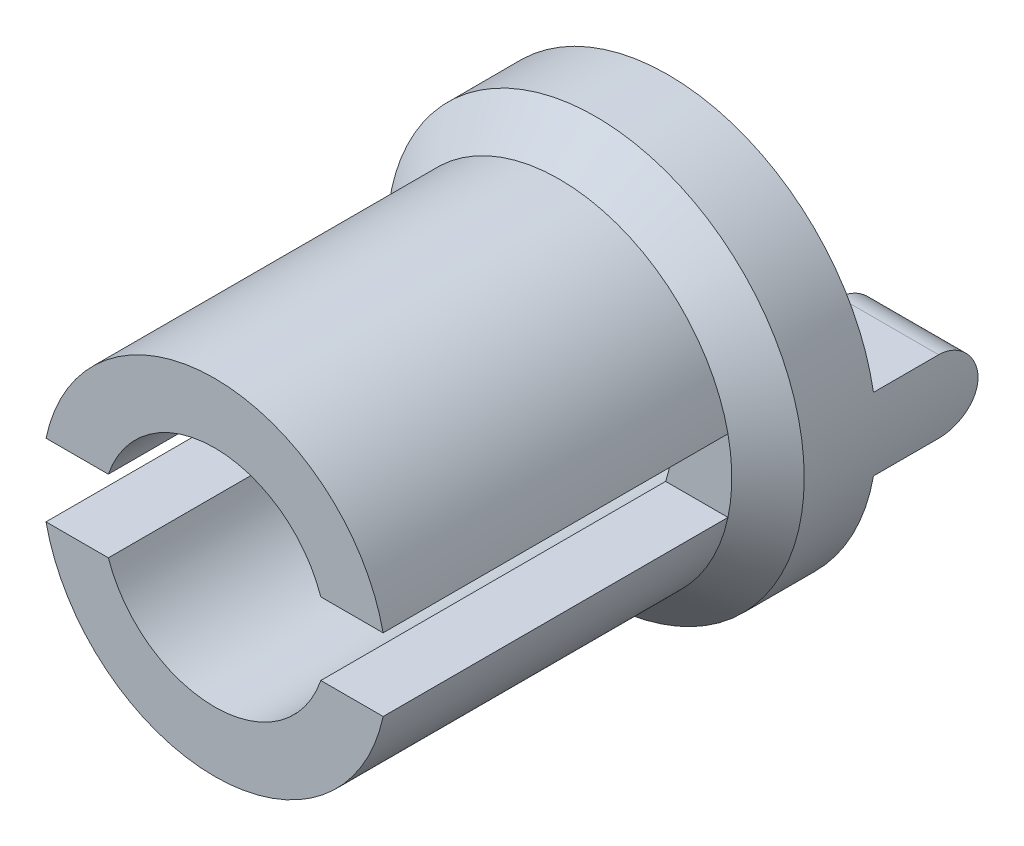
ISO-10303-21;
HEADER;
FILE_DESCRIPTION(('STEP AP214'),'2;1');
FILE_NAME('part.step','',(''),(''),'','','');
FILE_SCHEMA(('AUTOMOTIVE_DESIGN { 1 0 10303 214 1 1 1 1 }'));
ENDSEC;
DATA;
#1=APPLICATION_CONTEXT('core data for automotive mechanical design processes');
#2=APPLICATION_PROTOCOL_DEFINITION('international standard','automotive_design',2000,#1);
#3=PRODUCT_CONTEXT('',#1,'mechanical');
#4=PRODUCT('Part','Part','',(#3));
#5=PRODUCT_RELATED_PRODUCT_CATEGORY('part','',(#4));
#6=PRODUCT_DEFINITION_FORMATION('','',#4);
#7=PRODUCT_DEFINITION_CONTEXT('part definition',#1,'design');
#8=PRODUCT_DEFINITION('design','',#6,#7);
#9=PRODUCT_DEFINITION_SHAPE('','',#8);
#10=(LENGTH_UNIT() NAMED_UNIT(*) SI_UNIT(.MILLI.,.METRE.));
#11=(NAMED_UNIT(*) PLANE_ANGLE_UNIT() SI_UNIT($,.RADIAN.));
#12=(NAMED_UNIT(*) SI_UNIT($,.STERADIAN.) SOLID_ANGLE_UNIT());
#13=UNCERTAINTY_MEASURE_WITH_UNIT(LENGTH_MEASURE(1.E-05),#10,'distance_accuracy_value','');
#14=(GEOMETRIC_REPRESENTATION_CONTEXT(3) GLOBAL_UNCERTAINTY_ASSIGNED_CONTEXT((#13)) GLOBAL_UNIT_ASSIGNED_CONTEXT((#10,
#11,#12)) REPRESENTATION_CONTEXT('',''));
#15=CARTESIAN_POINT('',(0.,0.,0.));
#16=DIRECTION('',(0.,0.,1.));
#17=DIRECTION('',(1.,0.,0.));
#18=AXIS2_PLACEMENT_3D('',#15,#16,#17);
#19=CARTESIAN_POINT('',(0.,0.,3.));
#20=DIRECTION('',(0.,0.,1.));
#21=DIRECTION('',(1.,0.,0.));
#22=AXIS2_PLACEMENT_3D('',#19,#20,#21);
#23=PLANE('',#22);
#24=DIRECTION('',(1.,0.,0.));
#25=VECTOR('',#24,1.);
#26=CARTESIAN_POINT('',(0.,1.,3.));
#27=LINE('',#26,#25);
#28=CARTESIAN_POINT('',(-4.65632969730452,1.,3.));
#29=VERTEX_POINT('',#28);
#30=CARTESIAN_POINT('',(-2.93428015022424,1.,3.));
#31=VERTEX_POINT('',#30);
#32=EDGE_CURVE('E267',#29,#31,#27,.T.);
#33=ORIENTED_EDGE('',*,*,#32,.F.);
#34=CARTESIAN_POINT('',(0.,0.,3.));
#35=DIRECTION('',(0.,0.,1.));
#36=DIRECTION('',(1.,0.,0.));
#37=AXIS2_PLACEMENT_3D('',#34,#35,#36);
#38=CIRCLE('',#37,4.7625);
#39=CARTESIAN_POINT('',(-4.65632969730452,-1.,3.));
#40=VERTEX_POINT('',#39);
#41=EDGE_CURVE('E51',#29,#40,#38,.T.);
#42=ORIENTED_EDGE('',*,*,#41,.T.);
#43=DIRECTION('',(1.,0.,0.));
#44=VECTOR('',#43,1.);
#45=CARTESIAN_POINT('',(0.,-1.,3.));
#46=LINE('',#45,#44);
#47=CARTESIAN_POINT('',(-2.93428015022424,-1.,3.));
#48=VERTEX_POINT('',#47);
#49=EDGE_CURVE('E300',#40,#48,#46,.T.);
#50=ORIENTED_EDGE('',*,*,#49,.T.);
#51=CARTESIAN_POINT('',(0.,0.,3.));
#52=DIRECTION('',(0.,0.,1.));
#53=DIRECTION('',(1.,0.,0.));
#54=AXIS2_PLACEMENT_3D('',#51,#52,#53);
#55=CIRCLE('',#54,3.1);
#56=EDGE_CURVE('E317',#31,#48,#55,.T.);
#57=ORIENTED_EDGE('',*,*,#56,.F.);
#58=EDGE_LOOP('',(#33,#42,#50,#57));
#59=FACE_BOUND('',#58,.T.);
#60=ADVANCED_FACE('F42',(#59),#23,.T.);
#61=CARTESIAN_POINT('',(0.,0.,0.));
#62=DIRECTION('',(0.,0.,1.));
#63=DIRECTION('',(1.,0.,0.));
#64=AXIS2_PLACEMENT_3D('',#61,#62,#63);
#65=PLANE('',#64);
#66=DIRECTION('',(-1.,0.,0.));
#67=VECTOR('',#66,1.);
#68=CARTESIAN_POINT('',(0.,-1.,0.));
#69=LINE('',#68,#67);
#70=CARTESIAN_POINT('',(-2.93428015022424,-1.,0.));
#71=VERTEX_POINT('',#70);
#72=CARTESIAN_POINT('',(-5.67506883218169,-1.,0.));
#73=VERTEX_POINT('',#72);
#74=EDGE_CURVE('E171',#71,#73,#69,.T.);
#75=ORIENTED_EDGE('',*,*,#74,.F.);
#76=CARTESIAN_POINT('',(0.,0.,0.));
#77=DIRECTION('',(0.,0.,1.));
#78=DIRECTION('',(1.,0.,0.));
#79=AXIS2_PLACEMENT_3D('',#76,#77,#78);
#80=CIRCLE('',#79,3.1);
#81=CARTESIAN_POINT('',(2.93428015022424,-0.999999999999999,0.));
#82=VERTEX_POINT('',#81);
#83=EDGE_CURVE('E179',#71,#82,#80,.T.);
#84=ORIENTED_EDGE('',*,*,#83,.T.);
#85=DIRECTION('',(-1.,0.,0.));
#86=VECTOR('',#85,1.);
#87=CARTESIAN_POINT('',(0.,-0.999999999999999,0.));
#88=LINE('',#87,#86);
#89=CARTESIAN_POINT('',(5.67506883218169,-0.999999999999999,0.));
#90=VERTEX_POINT('',#89);
#91=EDGE_CURVE('E207',#90,#82,#88,.T.);
#92=ORIENTED_EDGE('',*,*,#91,.F.);
#93=CARTESIAN_POINT('',(0.,0.,0.));
#94=DIRECTION('',(0.,0.,1.));
#95=DIRECTION('',(1.,0.,0.));
#96=AXIS2_PLACEMENT_3D('',#93,#94,#95);
#97=CIRCLE('',#96,5.7625);
#98=EDGE_CURVE('E194',#73,#90,#97,.T.);
#99=ORIENTED_EDGE('',*,*,#98,.F.);
#100=EDGE_LOOP('',(#75,#84,#92,#99));
#101=FACE_BOUND('',#100,.T.);
#102=ADVANCED_FACE('F192',(#101),#65,.F.);
#103=CARTESIAN_POINT('',(2.93428015022424,1.,0.));
#104=VERTEX_POINT('',#103);
#105=CARTESIAN_POINT('',(-2.93428015022424,1.,0.));
#106=VERTEX_POINT('',#105);
#107=EDGE_CURVE('E188',#104,#106,#80,.T.);
#108=ORIENTED_EDGE('',*,*,#107,.T.);
#109=DIRECTION('',(-1.,0.,0.));
#110=VECTOR('',#109,1.);
#111=CARTESIAN_POINT('',(0.,1.,0.));
#112=LINE('',#111,#110);
#113=CARTESIAN_POINT('',(-5.67506883218169,1.,0.));
#114=VERTEX_POINT('',#113);
#115=EDGE_CURVE('E197',#106,#114,#112,.T.);
#116=ORIENTED_EDGE('',*,*,#115,.T.);
#117=CARTESIAN_POINT('',(5.67506883218169,1.,0.));
#118=VERTEX_POINT('',#117);
#119=EDGE_CURVE('E189',#118,#114,#97,.T.);
#120=ORIENTED_EDGE('',*,*,#119,.F.);
#121=DIRECTION('',(-1.,0.,0.));
#122=VECTOR('',#121,1.);
#123=CARTESIAN_POINT('',(0.,1.,0.));
#124=LINE('',#123,#122);
#125=EDGE_CURVE('E213',#118,#104,#124,.T.);
#126=ORIENTED_EDGE('',*,*,#125,.T.);
#127=EDGE_LOOP('',(#108,#116,#120,#126));
#128=FACE_BOUND('',#127,.T.);
#129=ADVANCED_FACE('F488',(#128),#65,.F.);
#130=DIRECTION('',(1.,0.,0.));
#131=VECTOR('',#130,1.);
#132=CARTESIAN_POINT('',(0.,-0.999999999999999,3.));
#133=LINE('',#132,#131);
#134=CARTESIAN_POINT('',(2.93428015022424,-0.999999999999999,3.));
#135=VERTEX_POINT('',#134);
#136=CARTESIAN_POINT('',(4.65632969730452,-0.999999999999999,3.));
#137=VERTEX_POINT('',#136);
#138=EDGE_CURVE('E308',#135,#137,#133,.T.);
#139=ORIENTED_EDGE('',*,*,#138,.T.);
#140=CARTESIAN_POINT('',(0.,0.,3.));
#141=DIRECTION('',(0.,0.,1.));
#142=DIRECTION('',(1.,0.,0.));
#143=AXIS2_PLACEMENT_3D('',#140,#141,#142);
#144=CIRCLE('',#143,4.7625);
#145=CARTESIAN_POINT('',(4.65632969730452,1.,3.));
#146=VERTEX_POINT('',#145);
#147=EDGE_CURVE('E404',#137,#146,#144,.T.);
#148=ORIENTED_EDGE('',*,*,#147,.T.);
#149=DIRECTION('',(1.,0.,0.));
#150=VECTOR('',#149,1.);
#151=CARTESIAN_POINT('',(0.,1.,3.));
#152=LINE('',#151,#150);
#153=CARTESIAN_POINT('',(2.93428015022424,1.,3.));
#154=VERTEX_POINT('',#153);
#155=EDGE_CURVE('E259',#154,#146,#152,.T.);
#156=ORIENTED_EDGE('',*,*,#155,.F.);
#157=EDGE_CURVE('E312',#135,#154,#55,.T.);
#158=ORIENTED_EDGE('',*,*,#157,.F.);
#159=EDGE_LOOP('',(#139,#148,#156,#158));
#160=FACE_BOUND('',#159,.T.);
#161=ADVANCED_FACE('F344',(#160),#23,.T.);
#162=CARTESIAN_POINT('',(0.,0.,3.));
#163=DIRECTION('',(0.,0.,-1.));
#164=DIRECTION('',(-1.,0.,0.));
#165=AXIS2_PLACEMENT_3D('',#162,#163,#164);
#166=CYLINDRICAL_SURFACE('',#165,5.7625);
#167=CARTESIAN_POINT('',(0.,0.,1.99999999999999));
#168=DIRECTION('',(0.,0.,1.));
#169=DIRECTION('',(1.,0.,0.));
#170=AXIS2_PLACEMENT_3D('',#167,#168,#169);
#171=CIRCLE('',#170,5.7625);
#172=CARTESIAN_POINT('',(5.7625,0.,1.99999999999999));
#173=VERTEX_POINT('',#172);
#174=EDGE_CURVE('E12',#173,#173,#171,.F.);
#175=ORIENTED_EDGE('',*,*,#174,.T.);
#176=EDGE_LOOP('',(#175));
#177=FACE_BOUND('',#176,.T.);
#178=CARTESIAN_POINT('',(-5.67506883218169,1.,-1.8));
#179=CARTESIAN_POINT('',(-5.67506761308075,1.000000065407,-1.82790897120952));
#180=CARTESIAN_POINT('',(-5.67527497134184,0.998830894949917,-1.85580436135374));
#181=CARTESIAN_POINT('',(-5.67609408232163,0.994168254377589,-1.91139130437918));
#182=CARTESIAN_POINT('',(-5.67670579270925,0.990675027564385,-1.93908287829083));
#183=CARTESIAN_POINT('',(-5.67912472225758,0.976751217564912,-2.02147102829651));
#184=CARTESIAN_POINT('',(-5.68151585375878,0.962876354040546,-2.0756091010125));
#185=CARTESIAN_POINT('',(-5.68758361984008,0.926356865417077,-2.180742820369));
#186=CARTESIAN_POINT('',(-5.69126053148962,0.903710350024101,-2.23173778692155));
#187=CARTESIAN_POINT('',(-5.69948387045683,0.85030417934323,-2.32921644227469));
#188=CARTESIAN_POINT('',(-5.70403034610672,0.819544073048633,-2.37569988009832));
#189=CARTESIAN_POINT('',(-5.71353378389499,0.750441398098643,-2.46331017142147));
#190=CARTESIAN_POINT('',(-5.71849420803219,0.71203016120623,-2.50438246694667));
#191=CARTESIAN_POINT('',(-5.72823672839943,0.628856064014108,-2.57953940798728));
#192=CARTESIAN_POINT('',(-5.73301879066794,0.584092001803853,-2.61362272824685));
#193=CARTESIAN_POINT('',(-5.74190332971123,0.489121584723125,-2.67404215307671));
#194=CARTESIAN_POINT('',(-5.74600101749023,0.438880638576444,-2.70032458847822));
#195=CARTESIAN_POINT('',(-5.75301259414362,0.334625004593369,-2.74404224757705));
#196=CARTESIAN_POINT('',(-5.75592727783155,0.280612879152169,-2.76148341334066));
#197=CARTESIAN_POINT('',(-5.75953260783793,0.188573623650048,-2.78279237808017));
#198=CARTESIAN_POINT('',(-5.76063956225957,0.151139402472241,-2.78923856903874));
#199=CARTESIAN_POINT('',(-5.76212569904172,0.0758092727272534,-2.79784328500391));
#200=CARTESIAN_POINT('',(-5.76250568111496,0.0379139176888234,-2.80000652160606));
#201=CARTESIAN_POINT('',(-5.7625,0.,-2.8));
#202=B_SPLINE_CURVE_WITH_KNOTS('',3,(#178,#179,#180,#181,#182,#183,#184,#185,#186,#187,#188,
#189,#190,#191,#192,#193,#194,#195,#196,#197,#198,#199,#200,#201),.UNSPECIFIED.,.F.,.F.,(4,2,2,
2,2,2,2,2,2,2,2,4),(0.,0.0836748099233242,0.167340861431851,0.334293708539799,0.501282554076887,
0.668280683908238,0.83685124416334,1.00545373942264,1.17519065568897,1.34481334292312,
1.45858123177262,1.57222389706663),.UNSPECIFIED.);
#203=CARTESIAN_POINT('',(-5.67506883218169,1.,-1.8));
#204=VERTEX_POINT('',#203);
#205=CARTESIAN_POINT('',(-5.7625,0.,-2.8));
#206=VERTEX_POINT('',#205);
#207=EDGE_CURVE('E355',#204,#206,#202,.T.);
#208=ORIENTED_EDGE('',*,*,#207,.T.);
#209=CARTESIAN_POINT('',(-5.7625,0.,-2.8));
#210=CARTESIAN_POINT('',(-5.7625011256584,-0.0279121800445883,-2.80000005673222));
#211=CARTESIAN_POINT('',(-5.76229694663717,-0.0558107894566316,-2.79883062550432));
#212=CARTESIAN_POINT('',(-5.76148993515163,-0.1114043518985,-2.79416688988909));
#213=CARTESIAN_POINT('',(-5.76088714323856,-0.139099325354644,-2.79067282198889));
#214=CARTESIAN_POINT('',(-5.75850229549269,-0.221498876087656,-2.7767453684338));
#215=CARTESIAN_POINT('',(-5.75614366145759,-0.275645184061358,-2.76286658402921));
#216=CARTESIAN_POINT('',(-5.75014636628449,-0.380795827446639,-2.72633568167711));
#217=CARTESIAN_POINT('',(-5.74650741228151,-0.431799440847596,-2.70368155630692));
#218=CARTESIAN_POINT('',(-5.73834903396463,-0.529292347652433,-2.65025760284812));
#219=CARTESIAN_POINT('',(-5.73382956825864,-0.575781428678063,-2.61948739320536));
#220=CARTESIAN_POINT('',(-5.72435926138972,-0.663385216920923,-2.55037447781006));
#221=CARTESIAN_POINT('',(-5.71940486721888,-0.704447136423945,-2.51196537530801));
#222=CARTESIAN_POINT('',(-5.70964917500229,-0.779584097439509,-2.4287998154759));
#223=CARTESIAN_POINT('',(-5.70484790726327,-0.813657762997791,-2.38404211106507));
#224=CARTESIAN_POINT('',(-5.69590690853097,-0.874066954956763,-2.28907737910652));
#225=CARTESIAN_POINT('',(-5.69177200552945,-0.900347073509347,-2.23883465129004));
#226=CARTESIAN_POINT('',(-5.68468561972967,-0.944059849120996,-2.13457540150781));
#227=CARTESIAN_POINT('',(-5.68173333281112,-0.961498520076803,-2.08056147321647));
#228=CARTESIAN_POINT('',(-5.67807934073008,-0.982800535313677,-1.98852908320348));
#229=CARTESIAN_POINT('',(-5.67695660430286,-0.989243595437331,-1.95110410646962));
#230=CARTESIAN_POINT('',(-5.67544872883625,-0.997844269319137,-1.87579193486806));
#231=CARTESIAN_POINT('',(-5.67506278872994,-1.00000653737687,-1.83790528711395));
#232=CARTESIAN_POINT('',(-5.67506883218169,-1.,-1.8));
#233=B_SPLINE_CURVE_WITH_KNOTS('',3,(#209,#210,#211,#212,#213,#214,#215,#216,#217,#218,#219,
#220,#221,#222,#223,#224,#225,#226,#227,#228,#229,#230,#231,#232),.UNSPECIFIED.,.F.,.F.,(4,2,2,
2,2,2,2,2,2,2,2,4),(0.,0.0836844653686418,0.167360418751614,0.334335933607548,0.501349667898434,
0.668371255255003,0.836913575458956,1.00548904905975,1.17523575140677,1.34486683769533,
1.45860720288724,1.57222383558073),.UNSPECIFIED.);
#234=CARTESIAN_POINT('',(-5.67506883218169,-1.,-1.8));
#235=VERTEX_POINT('',#234);
#236=EDGE_CURVE('E361',#206,#235,#233,.T.);
#237=ORIENTED_EDGE('',*,*,#236,.T.);
#238=DIRECTION('',(0.,0.,1.));
#239=VECTOR('',#238,1.);
#240=CARTESIAN_POINT('',(-5.67506883218169,-1.,-2.8));
#241=LINE('',#240,#239);
#242=EDGE_CURVE('E176',#235,#73,#241,.T.);
#243=ORIENTED_EDGE('',*,*,#242,.T.);
#244=ORIENTED_EDGE('',*,*,#98,.T.);
#245=DIRECTION('',(0.,0.,1.));
#246=VECTOR('',#245,1.);
#247=CARTESIAN_POINT('',(5.67506883218169,-0.999999999999999,-2.8));
#248=LINE('',#247,#246);
#249=CARTESIAN_POINT('',(5.67506883218169,-0.999999999999999,-1.8));
#250=VERTEX_POINT('',#249);
#251=EDGE_CURVE('E224',#250,#90,#248,.T.);
#252=ORIENTED_EDGE('',*,*,#251,.F.);
#253=CARTESIAN_POINT('',(5.67506883218169,-0.999999999999999,-1.8));
#254=CARTESIAN_POINT('',(5.67506761308075,-1.000000065407,-1.82790897120952));
#255=CARTESIAN_POINT('',(5.67527497134184,-0.998830894949916,-1.85580436135374));
#256=CARTESIAN_POINT('',(5.67609408232163,-0.994168254377588,-1.91139130437918));
#257=CARTESIAN_POINT('',(5.67670579270925,-0.990675027564385,-1.93908287829083));
#258=CARTESIAN_POINT('',(5.67912472225758,-0.976751217564912,-2.02147102829651));
#259=CARTESIAN_POINT('',(5.68151585375878,-0.962876354040545,-2.0756091010125));
#260=CARTESIAN_POINT('',(5.68758361984008,-0.926356865417076,-2.180742820369));
#261=CARTESIAN_POINT('',(5.69126053148962,-0.903710350024101,-2.23173778692155));
#262=CARTESIAN_POINT('',(5.69948387045683,-0.850304179343229,-2.32921644227469));
#263=CARTESIAN_POINT('',(5.70403034610672,-0.819544073048633,-2.37569988009832));
#264=CARTESIAN_POINT('',(5.71353378389499,-0.750441398098643,-2.46331017142147));
#265=CARTESIAN_POINT('',(5.71849420803219,-0.71203016120623,-2.50438246694667));
#266=CARTESIAN_POINT('',(5.72823672839943,-0.628856064014108,-2.57953940798728));
#267=CARTESIAN_POINT('',(5.73301879066794,-0.584092001803853,-2.61362272824685));
#268=CARTESIAN_POINT('',(5.74190332971123,-0.489121584723125,-2.67404215307671));
#269=CARTESIAN_POINT('',(5.74600101749023,-0.438880638576444,-2.70032458847822));
#270=CARTESIAN_POINT('',(5.75301259414362,-0.334625004593369,-2.74404224757705));
#271=CARTESIAN_POINT('',(5.75592727783155,-0.280612879152169,-2.76148341334066));
#272=CARTESIAN_POINT('',(5.75953260783793,-0.188573623650048,-2.78279237808017));
#273=CARTESIAN_POINT('',(5.76063956225957,-0.151139402472241,-2.78923856903874));
#274=CARTESIAN_POINT('',(5.76212569904172,-0.0758092727272531,-2.79784328500391));
#275=CARTESIAN_POINT('',(5.76250568111496,-0.037913917688823,-2.80000652160606));
#276=CARTESIAN_POINT('',(5.7625,0.,-2.8));
#277=B_SPLINE_CURVE_WITH_KNOTS('',3,(#253,#254,#255,#256,#257,#258,#259,#260,#261,#262,#263,
#264,#265,#266,#267,#268,#269,#270,#271,#272,#273,#274,#275,#276),.UNSPECIFIED.,.F.,.F.,(4,2,2,
2,2,2,2,2,2,2,2,4),(0.,0.0836748099233242,0.167340861431851,0.334293708539799,0.501282554076887,
0.668280683908238,0.83685124416334,1.00545373942264,1.17519065568897,1.34481334292312,
1.45858123177262,1.57222389706663),.UNSPECIFIED.);
#278=CARTESIAN_POINT('',(5.7625,0.,-2.8));
#279=VERTEX_POINT('',#278);
#280=EDGE_CURVE('E316',#250,#279,#277,.T.);
#281=ORIENTED_EDGE('',*,*,#280,.T.);
#282=CARTESIAN_POINT('',(5.7625,0.,-2.8));
#283=CARTESIAN_POINT('',(5.7625011256584,0.0279121800445883,-2.80000005673222));
#284=CARTESIAN_POINT('',(5.76229694663717,0.0558107894566315,-2.79883062550432));
#285=CARTESIAN_POINT('',(5.76148993515163,0.1114043518985,-2.79416688988909));
#286=CARTESIAN_POINT('',(5.76088714323856,0.139099325354644,-2.79067282198889));
#287=CARTESIAN_POINT('',(5.75850229549269,0.221498876087656,-2.7767453684338));
#288=CARTESIAN_POINT('',(5.75614366145759,0.275645184061358,-2.76286658402921));
#289=CARTESIAN_POINT('',(5.75014636628449,0.380795827446639,-2.72633568167711));
#290=CARTESIAN_POINT('',(5.74650741228151,0.431799440847596,-2.70368155630692));
#291=CARTESIAN_POINT('',(5.73834903396463,0.529292347652433,-2.65025760284812));
#292=CARTESIAN_POINT('',(5.73382956825864,0.575781428678063,-2.61948739320536));
#293=CARTESIAN_POINT('',(5.72435926138972,0.663385216920923,-2.55037447781006));
#294=CARTESIAN_POINT('',(5.71940486721888,0.704447136423945,-2.51196537530801));
#295=CARTESIAN_POINT('',(5.70964917500229,0.779584097439509,-2.4287998154759));
#296=CARTESIAN_POINT('',(5.70484790726327,0.813657762997791,-2.38404211106507));
#297=CARTESIAN_POINT('',(5.69590690853097,0.874066954956763,-2.28907737910652));
#298=CARTESIAN_POINT('',(5.69177200552945,0.900347073509347,-2.23883465129004));
#299=CARTESIAN_POINT('',(5.68468561972967,0.944059849120996,-2.13457540150781));
#300=CARTESIAN_POINT('',(5.68173333281112,0.961498520076803,-2.08056147321647));
#301=CARTESIAN_POINT('',(5.67807934073008,0.982800535313677,-1.98852908320348));
#302=CARTESIAN_POINT('',(5.67695660430286,0.989243595437331,-1.95110410646962));
#303=CARTESIAN_POINT('',(5.67544872883625,0.997844269319137,-1.87579193486806));
#304=CARTESIAN_POINT('',(5.67506278872994,1.00000653737687,-1.83790528711395));
#305=CARTESIAN_POINT('',(5.67506883218169,1.,-1.8));
#306=B_SPLINE_CURVE_WITH_KNOTS('',3,(#282,#283,#284,#285,#286,#287,#288,#289,#290,#291,#292,
#293,#294,#295,#296,#297,#298,#299,#300,#301,#302,#303,#304,#305),.UNSPECIFIED.,.F.,.F.,(4,2,2,
2,2,2,2,2,2,2,2,4),(0.,0.0836844653686418,0.167360418751614,0.334335933607548,0.501349667898434,
0.668371255255003,0.836913575458956,1.00548904905975,1.17523575140677,1.34486683769533,
1.45860720288724,1.57222383558073),.UNSPECIFIED.);
#307=CARTESIAN_POINT('',(5.67506883218169,1.,-1.8));
#308=VERTEX_POINT('',#307);
#309=EDGE_CURVE('E330',#279,#308,#306,.T.);
#310=ORIENTED_EDGE('',*,*,#309,.T.);
#311=DIRECTION('',(0.,0.,1.));
#312=VECTOR('',#311,1.);
#313=CARTESIAN_POINT('',(5.67506883218169,1.,-2.8));
#314=LINE('',#313,#312);
#315=EDGE_CURVE('E221',#308,#118,#314,.T.);
#316=ORIENTED_EDGE('',*,*,#315,.T.);
#317=ORIENTED_EDGE('',*,*,#119,.T.);
#318=DIRECTION('',(0.,0.,1.));
#319=VECTOR('',#318,1.);
#320=CARTESIAN_POINT('',(-5.67506883218169,1.,-2.8));
#321=LINE('',#320,#319);
#322=EDGE_CURVE('E196',#204,#114,#321,.T.);
#323=ORIENTED_EDGE('',*,*,#322,.F.);
#324=EDGE_LOOP('',(#208,#237,#243,#244,#252,#281,#310,#316,#317,#323));
#325=FACE_BOUND('',#324,.T.);
#326=ADVANCED_FACE('F339',(#177,#325),#166,.T.);
#327=CARTESIAN_POINT('',(0.,0.,3.));
#328=DIRECTION('',(0.,0.,-1.));
#329=DIRECTION('',(-1.,0.,0.));
#330=AXIS2_PLACEMENT_3D('',#327,#328,#329);
#331=CYLINDRICAL_SURFACE('',#330,3.1);
#332=DIRECTION('',(0.,0.,1.));
#333=VECTOR('',#332,1.);
#334=CARTESIAN_POINT('',(-2.93428015022424,-1.,-2.8));
#335=LINE('',#334,#333);
#336=CARTESIAN_POINT('',(-2.93428015022424,-1.,-1.8));
#337=VERTEX_POINT('',#336);
#338=EDGE_CURVE('E166',#337,#71,#335,.T.);
#339=ORIENTED_EDGE('',*,*,#338,.F.);
#340=CARTESIAN_POINT('',(-2.93428015022424,-1.,-1.8));
#341=CARTESIAN_POINT('',(-2.93427756541015,-1.00000068785592,-1.82734584612005));
#342=CARTESIAN_POINT('',(-2.9346629064306,-0.998877586230568,-1.8546777963128));
#343=CARTESIAN_POINT('',(-2.93618313621529,-0.994402812003836,-1.9091307928062));
#344=CARTESIAN_POINT('',(-2.93731783397429,-0.991051707301707,-1.93625189106948));
#345=CARTESIAN_POINT('',(-2.94179557894908,-0.97771752803092,-2.01684281855541));
#346=CARTESIAN_POINT('',(-2.94621267275013,-0.964453249607933,-2.06974849858701));
#347=CARTESIAN_POINT('',(-2.95737859391683,-0.929645523114282,-2.17242736091256));
#348=CARTESIAN_POINT('',(-2.96412633488719,-0.908105931928739,-2.22220198994142));
#349=CARTESIAN_POINT('',(-2.9791884821467,-0.85739937341686,-2.31747402711879));
#350=CARTESIAN_POINT('',(-2.98750382664413,-0.828227834306057,-2.36296884923981));
#351=CARTESIAN_POINT('',(-3.00510177739248,-0.761954270288802,-2.45001262877773));
#352=CARTESIAN_POINT('',(-3.01440724444984,-0.724622356249698,-2.49138188559734));
#353=CARTESIAN_POINT('',(-3.03274395746871,-0.643574393849178,-2.56739762242579));
#354=CARTESIAN_POINT('',(-3.0417751483956,-0.59985707432083,-2.60204276063325));
#355=CARTESIAN_POINT('',(-3.05881229347135,-0.505961205124598,-2.66444090018441));
#356=CARTESIAN_POINT('',(-3.06678759757853,-0.455650271089954,-2.69200360028933));
#357=CARTESIAN_POINT('',(-3.08053728193154,-0.350821585912233,-2.73818850842966));
#358=CARTESIAN_POINT('',(-3.08631367863143,-0.296307744387944,-2.75681891169735));
#359=CARTESIAN_POINT('',(-3.0937084609747,-0.201288160936485,-2.78036658374531));
#360=CARTESIAN_POINT('',(-3.09605199308936,-0.161424262741119,-2.78771236456971));
#361=CARTESIAN_POINT('',(-3.09920481227347,-0.0810486453956665,-2.79753494679028));
#362=CARTESIAN_POINT('',(-3.10001432498129,-0.0405370224033328,-2.80001246425953));
#363=CARTESIAN_POINT('',(-3.1,0.,-2.8));
#364=B_SPLINE_CURVE_WITH_KNOTS('',3,(#340,#341,#342,#343,#344,#345,#346,#347,#348,#349,#350,
#351,#352,#353,#354,#355,#356,#357,#358,#359,#360,#361,#362,#363),.UNSPECIFIED.,.F.,.F.,(4,2,2,
2,2,2,2,2,2,2,2,4),(0.,0.0819846222601937,0.163948355336898,0.32725947520905,0.49049457262417,
0.653827677947062,0.82254944054246,0.991304837115021,1.1642074705071,1.33695116362041,
1.45844985811457,1.57993068002208),.UNSPECIFIED.);
#365=CARTESIAN_POINT('',(-3.1,0.,-2.8));
#366=VERTEX_POINT('',#365);
#367=EDGE_CURVE('E63',#337,#366,#364,.T.);
#368=ORIENTED_EDGE('',*,*,#367,.T.);
#369=CARTESIAN_POINT('',(-3.1,0.,-2.8));
#370=CARTESIAN_POINT('',(-3.1000019668094,0.0273833711571263,-2.80000058804596));
#371=CARTESIAN_POINT('',(-3.09963673694339,0.0547529766596152,-2.79887449671084));
#372=CARTESIAN_POINT('',(-3.0981928871839,0.109283455550124,-2.79438716417341));
#373=CARTESIAN_POINT('',(-3.09711442378671,0.136444373405728,-2.79102641329479));
#374=CARTESIAN_POINT('',(-3.09285054262351,0.217168973171312,-2.77765045809757));
#375=CARTESIAN_POINT('',(-3.08863633344346,0.270171360326983,-2.76434124458805));
#376=CARTESIAN_POINT('',(-3.07790783006869,0.373049499382117,-2.72940290986593));
#377=CARTESIAN_POINT('',(-3.07139424972524,0.422926216009167,-2.70777637062247));
#378=CARTESIAN_POINT('',(-3.05673462660275,0.518368897490144,-2.65686623058404));
#379=CARTESIAN_POINT('',(-3.04858777354373,0.563932706091969,-2.62757882696492));
#380=CARTESIAN_POINT('',(-3.03122835089166,0.650907895063458,-2.56118322169925));
#381=CARTESIAN_POINT('',(-3.02199158126494,0.692158857747181,-2.52387133998996));
#382=CARTESIAN_POINT('',(-3.00362871404318,0.767943901298614,-2.4429131833499));
#383=CARTESIAN_POINT('',(-2.99450264906303,0.802476045724597,-2.39926508855895));
#384=CARTESIAN_POINT('',(-2.97712830118098,0.86474460865614,-2.3054418967375));
#385=CARTESIAN_POINT('',(-2.96891030810419,0.892272767976829,-2.25512258252171));
#386=CARTESIAN_POINT('',(-2.95465902063573,0.938390062839536,-2.15028018126251));
#387=CARTESIAN_POINT('',(-2.94862350470777,0.956988294484957,-2.09576143778388));
#388=CARTESIAN_POINT('',(-2.94088613873149,0.980456598744644,-2.00082745300405));
#389=CARTESIAN_POINT('',(-2.93842842740886,0.9877675265083,-1.9610610711098));
#390=CARTESIAN_POINT('',(-2.93511663838947,0.997545637473703,-1.88087206266102));
#391=CARTESIAN_POINT('',(-2.93426259967109,1.00001270294208,-1.8404494201797));
#392=CARTESIAN_POINT('',(-2.93428015022424,1.,-1.8));
#393=B_SPLINE_CURVE_WITH_KNOTS('',3,(#369,#370,#371,#372,#373,#374,#375,#376,#377,#378,#379,
#380,#381,#382,#383,#384,#385,#386,#387,#388,#389,#390,#391,#392),.UNSPECIFIED.,.F.,.F.,(4,2,2,
2,2,2,2,2,2,2,2,4),(0.,0.0820975585042678,0.164177109298373,0.327753437669193,0.491279027547998,
0.654885945467043,0.823277801181075,0.991718117732168,1.16469855433895,1.33750241576485,
1.45871484375241,1.57993021785412),.UNSPECIFIED.);
#394=CARTESIAN_POINT('',(-2.93428015022424,1.,-1.8));
#395=VERTEX_POINT('',#394);
#396=EDGE_CURVE('E58',#366,#395,#393,.T.);
#397=ORIENTED_EDGE('',*,*,#396,.T.);
#398=DIRECTION('',(0.,0.,1.));
#399=VECTOR('',#398,1.);
#400=CARTESIAN_POINT('',(-2.93428015022424,1.,-2.8));
#401=LINE('',#400,#399);
#402=EDGE_CURVE('E175',#395,#106,#401,.T.);
#403=ORIENTED_EDGE('',*,*,#402,.T.);
#404=ORIENTED_EDGE('',*,*,#107,.F.);
#405=DIRECTION('',(0.,0.,1.));
#406=VECTOR('',#405,1.);
#407=CARTESIAN_POINT('',(2.93428015022424,1.,-2.8));
#408=LINE('',#407,#406);
#409=CARTESIAN_POINT('',(2.93428015022424,1.,-1.8));
#410=VERTEX_POINT('',#409);
#411=EDGE_CURVE('E217',#410,#104,#408,.T.);
#412=ORIENTED_EDGE('',*,*,#411,.F.);
#413=CARTESIAN_POINT('',(2.93428015022424,1.,-1.8));
#414=CARTESIAN_POINT('',(2.93427756541016,1.00000068785592,-1.82734584612005));
#415=CARTESIAN_POINT('',(2.9346629064306,0.998877586230568,-1.8546777963128));
#416=CARTESIAN_POINT('',(2.93618313621529,0.994402812003836,-1.9091307928062));
#417=CARTESIAN_POINT('',(2.93731783397429,0.991051707301707,-1.93625189106948));
#418=CARTESIAN_POINT('',(2.94179557894908,0.977717528030921,-2.01684281855541));
#419=CARTESIAN_POINT('',(2.94621267275013,0.964453249607933,-2.06974849858701));
#420=CARTESIAN_POINT('',(2.95737859391683,0.929645523114282,-2.17242736091256));
#421=CARTESIAN_POINT('',(2.96412633488719,0.90810593192874,-2.22220198994142));
#422=CARTESIAN_POINT('',(2.9791884821467,0.85739937341686,-2.31747402711879));
#423=CARTESIAN_POINT('',(2.98750382664413,0.828227834306058,-2.36296884923981));
#424=CARTESIAN_POINT('',(3.00510177739248,0.761954270288803,-2.45001262877773));
#425=CARTESIAN_POINT('',(3.01440724444984,0.724622356249699,-2.49138188559734));
#426=CARTESIAN_POINT('',(3.03274395746871,0.643574393849178,-2.56739762242579));
#427=CARTESIAN_POINT('',(3.0417751483956,0.59985707432083,-2.60204276063325));
#428=CARTESIAN_POINT('',(3.05881229347135,0.505961205124599,-2.66444090018441));
#429=CARTESIAN_POINT('',(3.06678759757853,0.455650271089954,-2.69200360028933));
#430=CARTESIAN_POINT('',(3.08053728193154,0.350821585912233,-2.73818850842966));
#431=CARTESIAN_POINT('',(3.08631367863143,0.296307744387944,-2.75681891169735));
#432=CARTESIAN_POINT('',(3.0937084609747,0.201288160936485,-2.78036658374531));
#433=CARTESIAN_POINT('',(3.09605199308936,0.161424262741119,-2.78771236456971));
#434=CARTESIAN_POINT('',(3.09920481227347,0.0810486453956667,-2.79753494679028));
#435=CARTESIAN_POINT('',(3.10001432498129,0.0405370224033329,-2.80001246425953));
#436=CARTESIAN_POINT('',(3.1,0.,-2.8));
#437=B_SPLINE_CURVE_WITH_KNOTS('',3,(#413,#414,#415,#416,#417,#418,#419,#420,#421,#422,#423,
#424,#425,#426,#427,#428,#429,#430,#431,#432,#433,#434,#435,#436),.UNSPECIFIED.,.F.,.F.,(4,2,2,
2,2,2,2,2,2,2,2,4),(0.,0.0819846222601937,0.163948355336898,0.32725947520905,0.49049457262417,
0.653827677947062,0.82254944054246,0.991304837115021,1.1642074705071,1.33695116362041,
1.45844985811457,1.57993068002208),.UNSPECIFIED.);
#438=CARTESIAN_POINT('',(3.1,0.,-2.8));
#439=VERTEX_POINT('',#438);
#440=EDGE_CURVE('E382',#410,#439,#437,.T.);
#441=ORIENTED_EDGE('',*,*,#440,.T.);
#442=CARTESIAN_POINT('',(3.1,0.,-2.8));
#443=CARTESIAN_POINT('',(3.1000019668094,-0.027383371157124,-2.80000058804596));
#444=CARTESIAN_POINT('',(3.09963673694339,-0.0547529766596129,-2.79887449671084));
#445=CARTESIAN_POINT('',(3.0981928871839,-0.109283455550122,-2.79438716417341));
#446=CARTESIAN_POINT('',(3.09711442378671,-0.136444373405726,-2.79102641329479));
#447=CARTESIAN_POINT('',(3.09285054262351,-0.217168973171309,-2.77765045809757));
#448=CARTESIAN_POINT('',(3.08863633344346,-0.270171360326981,-2.76434124458805));
#449=CARTESIAN_POINT('',(3.07790783006869,-0.373049499382114,-2.72940290986593));
#450=CARTESIAN_POINT('',(3.07139424972524,-0.422926216009164,-2.70777637062247));
#451=CARTESIAN_POINT('',(3.05673462660275,-0.518368897490142,-2.65686623058404));
#452=CARTESIAN_POINT('',(3.04858777354373,-0.563932706091966,-2.62757882696492));
#453=CARTESIAN_POINT('',(3.03122835089166,-0.650907895063455,-2.56118322169925));
#454=CARTESIAN_POINT('',(3.02199158126494,-0.692158857747178,-2.52387133998996));
#455=CARTESIAN_POINT('',(3.00362871404318,-0.767943901298611,-2.4429131833499));
#456=CARTESIAN_POINT('',(2.99450264906303,-0.802476045724594,-2.39926508855895));
#457=CARTESIAN_POINT('',(2.97712830118098,-0.864744608656138,-2.3054418967375));
#458=CARTESIAN_POINT('',(2.96891030810419,-0.892272767976826,-2.25512258252171));
#459=CARTESIAN_POINT('',(2.95465902063573,-0.938390062839533,-2.15028018126251));
#460=CARTESIAN_POINT('',(2.94862350470777,-0.956988294484954,-2.09576143778388));
#461=CARTESIAN_POINT('',(2.94088613873149,-0.980456598744641,-2.00082745300405));
#462=CARTESIAN_POINT('',(2.93842842740886,-0.987767526508298,-1.96106107110981));
#463=CARTESIAN_POINT('',(2.93511663838947,-0.997545637473701,-1.88087206266102));
#464=CARTESIAN_POINT('',(2.93426259967109,-1.00001270294208,-1.8404494201797));
#465=CARTESIAN_POINT('',(2.93428015022424,-0.999999999999999,-1.8));
#466=B_SPLINE_CURVE_WITH_KNOTS('',3,(#442,#443,#444,#445,#446,#447,#448,#449,#450,#451,#452,
#453,#454,#455,#456,#457,#458,#459,#460,#461,#462,#463,#464,#465),.UNSPECIFIED.,.F.,.F.,(4,2,2,
2,2,2,2,2,2,2,2,4),(0.,0.0820975585042678,0.164177109298373,0.327753437669192,0.491279027547998,
0.654885945467043,0.823277801181075,0.991718117732168,1.16469855433895,1.33750241576485,
1.45871484375241,1.57993021785412),.UNSPECIFIED.);
#467=CARTESIAN_POINT('',(2.93428015022424,-0.999999999999999,-1.8));
#468=VERTEX_POINT('',#467);
#469=EDGE_CURVE('E459',#439,#468,#466,.T.);
#470=ORIENTED_EDGE('',*,*,#469,.T.);
#471=DIRECTION('',(0.,0.,1.));
#472=VECTOR('',#471,1.);
#473=CARTESIAN_POINT('',(2.93428015022424,-0.999999999999999,-2.8));
#474=LINE('',#473,#472);
#475=EDGE_CURVE('E183',#468,#82,#474,.T.);
#476=ORIENTED_EDGE('',*,*,#475,.T.);
#477=ORIENTED_EDGE('',*,*,#83,.F.);
#478=EDGE_LOOP('',(#339,#368,#397,#403,#404,#412,#441,#470,#476,#477));
#479=FACE_BOUND('',#478,.T.);
#480=ORIENTED_EDGE('',*,*,#157,.T.);
#481=DIRECTION('',(0.,0.,-1.));
#482=VECTOR('',#481,1.);
#483=CARTESIAN_POINT('',(2.93428015022424,1.,32.0940047416357));
#484=LINE('',#483,#482);
#485=CARTESIAN_POINT('',(2.93428015022424,1.,12.525));
#486=VERTEX_POINT('',#485);
#487=EDGE_CURVE('E238',#486,#154,#484,.T.);
#488=ORIENTED_EDGE('',*,*,#487,.F.);
#489=CARTESIAN_POINT('',(0.,0.,12.525));
#490=DIRECTION('',(0.,0.,1.));
#491=DIRECTION('',(1.,0.,0.));
#492=AXIS2_PLACEMENT_3D('',#489,#490,#491);
#493=CIRCLE('',#492,3.1);
#494=CARTESIAN_POINT('',(-2.93428015022424,1.,12.525));
#495=VERTEX_POINT('',#494);
#496=EDGE_CURVE('E229',#486,#495,#493,.T.);
#497=ORIENTED_EDGE('',*,*,#496,.T.);
#498=DIRECTION('',(0.,0.,-1.));
#499=VECTOR('',#498,1.);
#500=CARTESIAN_POINT('',(-2.93428015022424,1.,32.0940047416357));
#501=LINE('',#500,#499);
#502=EDGE_CURVE('E233',#495,#31,#501,.T.);
#503=ORIENTED_EDGE('',*,*,#502,.T.);
#504=ORIENTED_EDGE('',*,*,#56,.T.);
#505=DIRECTION('',(0.,0.,-1.));
#506=VECTOR('',#505,1.);
#507=CARTESIAN_POINT('',(-2.93428015022424,-1.,32.0940047416357));
#508=LINE('',#507,#506);
#509=CARTESIAN_POINT('',(-2.93428015022424,-1.,12.525));
#510=VERTEX_POINT('',#509);
#511=EDGE_CURVE('E289',#510,#48,#508,.T.);
#512=ORIENTED_EDGE('',*,*,#511,.F.);
#513=CARTESIAN_POINT('',(0.,0.,12.525));
#514=DIRECTION('',(0.,0.,1.));
#515=DIRECTION('',(1.,0.,0.));
#516=AXIS2_PLACEMENT_3D('',#513,#514,#515);
#517=CIRCLE('',#516,3.1);
#518=CARTESIAN_POINT('',(2.93428015022424,-0.999999999999999,12.525));
#519=VERTEX_POINT('',#518);
#520=EDGE_CURVE('E272',#510,#519,#517,.T.);
#521=ORIENTED_EDGE('',*,*,#520,.T.);
#522=DIRECTION('',(0.,0.,-1.));
#523=VECTOR('',#522,1.);
#524=CARTESIAN_POINT('',(2.93428015022424,-0.999999999999999,32.0940047416357));
#525=LINE('',#524,#523);
#526=EDGE_CURVE('E276',#519,#135,#525,.T.);
#527=ORIENTED_EDGE('',*,*,#526,.T.);
#528=EDGE_LOOP('',(#480,#488,#497,#503,#504,#512,#521,#527));
#529=FACE_BOUND('',#528,.T.);
#530=ADVANCED_FACE('F180',(#479,#529),#331,.F.);
#531=CARTESIAN_POINT('',(0.,0.,12.525));
#532=DIRECTION('',(0.,0.,1.));
#533=DIRECTION('',(1.,0.,0.));
#534=AXIS2_PLACEMENT_3D('',#531,#532,#533);
#535=PLANE('',#534);
#536=ORIENTED_EDGE('',*,*,#520,.F.);
#537=DIRECTION('',(-1.,0.,0.));
#538=VECTOR('',#537,1.);
#539=CARTESIAN_POINT('',(0.,-1.,12.525));
#540=LINE('',#539,#538);
#541=CARTESIAN_POINT('',(-4.65632969730452,-1.,12.525));
#542=VERTEX_POINT('',#541);
#543=EDGE_CURVE('E271',#510,#542,#540,.T.);
#544=ORIENTED_EDGE('',*,*,#543,.T.);
#545=CARTESIAN_POINT('',(0.,0.,12.525));
#546=DIRECTION('',(0.,0.,1.));
#547=DIRECTION('',(1.,0.,0.));
#548=AXIS2_PLACEMENT_3D('',#545,#546,#547);
#549=CIRCLE('',#548,4.7625);
#550=CARTESIAN_POINT('',(4.65632969730452,-0.999999999999999,12.525));
#551=VERTEX_POINT('',#550);
#552=EDGE_CURVE('E280',#542,#551,#549,.T.);
#553=ORIENTED_EDGE('',*,*,#552,.T.);
#554=DIRECTION('',(-1.,0.,0.));
#555=VECTOR('',#554,1.);
#556=CARTESIAN_POINT('',(0.,-0.999999999999999,12.525));
#557=LINE('',#556,#555);
#558=EDGE_CURVE('E277',#551,#519,#557,.T.);
#559=ORIENTED_EDGE('',*,*,#558,.T.);
#560=EDGE_LOOP('',(#536,#544,#553,#559));
#561=FACE_BOUND('',#560,.T.);
#562=ADVANCED_FACE('F447',(#561),#535,.T.);
#563=CARTESIAN_POINT('',(0.,-0.999999999999999,32.0940047416357));
#564=DIRECTION('',(0.,-1.,0.));
#565=DIRECTION('',(0.,0.,-1.));
#566=AXIS2_PLACEMENT_3D('',#563,#564,#565);
#567=PLANE('',#566);
#568=ORIENTED_EDGE('',*,*,#138,.F.);
#569=ORIENTED_EDGE('',*,*,#526,.F.);
#570=ORIENTED_EDGE('',*,*,#558,.F.);
#571=DIRECTION('',(0.,0.,-1.));
#572=VECTOR('',#571,1.);
#573=CARTESIAN_POINT('',(4.65632969730452,-0.999999999999999,32.0940047416357));
#574=LINE('',#573,#572);
#575=EDGE_CURVE('E290',#551,#137,#574,.T.);
#576=ORIENTED_EDGE('',*,*,#575,.T.);
#577=EDGE_LOOP('',(#568,#569,#570,#576));
#578=FACE_BOUND('',#577,.T.);
#579=ADVANCED_FACE('F445',(#578),#567,.F.);
#580=CARTESIAN_POINT('',(0.,0.,32.0940047416357));
#581=DIRECTION('',(0.,0.,-1.));
#582=DIRECTION('',(-1.,0.,0.));
#583=AXIS2_PLACEMENT_3D('',#580,#581,#582);
#584=CYLINDRICAL_SURFACE('',#583,4.7625);
#585=CARTESIAN_POINT('',(0.,0.,3.));
#586=DIRECTION('',(0.,0.,1.));
#587=DIRECTION('',(1.,0.,0.));
#588=AXIS2_PLACEMENT_3D('',#585,#586,#587);
#589=CIRCLE('',#588,4.7625);
#590=EDGE_CURVE('E304',#137,#40,#589,.F.);
#591=ORIENTED_EDGE('',*,*,#590,.F.);
#592=ORIENTED_EDGE('',*,*,#575,.F.);
#593=ORIENTED_EDGE('',*,*,#552,.F.);
#594=DIRECTION('',(0.,0.,-1.));
#595=VECTOR('',#594,1.);
#596=CARTESIAN_POINT('',(-4.65632969730452,-1.,32.0940047416357));
#597=LINE('',#596,#595);
#598=EDGE_CURVE('E285',#542,#40,#597,.T.);
#599=ORIENTED_EDGE('',*,*,#598,.T.);
#600=EDGE_LOOP('',(#591,#592,#593,#599));
#601=FACE_BOUND('',#600,.T.);
#602=ADVANCED_FACE('F426',(#601),#584,.T.);
#603=CARTESIAN_POINT('',(0.,-1.,32.0940047416357));
#604=DIRECTION('',(0.,-1.,0.));
#605=DIRECTION('',(1.,0.,0.));
#606=AXIS2_PLACEMENT_3D('',#603,#604,#605);
#607=PLANE('',#606);
#608=ORIENTED_EDGE('',*,*,#49,.F.);
#609=ORIENTED_EDGE('',*,*,#598,.F.);
#610=ORIENTED_EDGE('',*,*,#543,.F.);
#611=ORIENTED_EDGE('',*,*,#511,.T.);
#612=EDGE_LOOP('',(#608,#609,#610,#611));
#613=FACE_BOUND('',#612,.T.);
#614=ADVANCED_FACE('F421',(#613),#607,.F.);
#615=CARTESIAN_POINT('',(0.,0.,12.525));
#616=DIRECTION('',(0.,0.,1.));
#617=DIRECTION('',(1.,0.,0.));
#618=AXIS2_PLACEMENT_3D('',#615,#616,#617);
#619=PLANE('',#618);
#620=DIRECTION('',(-1.,0.,0.));
#621=VECTOR('',#620,1.);
#622=CARTESIAN_POINT('',(0.,1.,12.525));
#623=LINE('',#622,#621);
#624=CARTESIAN_POINT('',(4.65632969730452,1.,12.525));
#625=VERTEX_POINT('',#624);
#626=EDGE_CURVE('E234',#625,#486,#623,.T.);
#627=ORIENTED_EDGE('',*,*,#626,.F.);
#628=CARTESIAN_POINT('',(0.,0.,12.525));
#629=DIRECTION('',(0.,0.,1.));
#630=DIRECTION('',(1.,0.,0.));
#631=AXIS2_PLACEMENT_3D('',#628,#629,#630);
#632=CIRCLE('',#631,4.7625);
#633=CARTESIAN_POINT('',(-4.65632969730452,1.,12.525));
#634=VERTEX_POINT('',#633);
#635=EDGE_CURVE('E220',#625,#634,#632,.T.);
#636=ORIENTED_EDGE('',*,*,#635,.T.);
#637=DIRECTION('',(-1.,0.,0.));
#638=VECTOR('',#637,1.);
#639=CARTESIAN_POINT('',(0.,1.,12.525));
#640=LINE('',#639,#638);
#641=EDGE_CURVE('E242',#495,#634,#640,.T.);
#642=ORIENTED_EDGE('',*,*,#641,.F.);
#643=ORIENTED_EDGE('',*,*,#496,.F.);
#644=EDGE_LOOP('',(#627,#636,#642,#643));
#645=FACE_BOUND('',#644,.T.);
#646=ADVANCED_FACE('F440',(#645),#619,.T.);
#647=CARTESIAN_POINT('',(0.,1.,32.0940047416357));
#648=DIRECTION('',(0.,-1.,0.));
#649=DIRECTION('',(1.,0.,0.));
#650=AXIS2_PLACEMENT_3D('',#647,#648,#649);
#651=PLANE('',#650);
#652=DIRECTION('',(0.,0.,-1.));
#653=VECTOR('',#652,1.);
#654=CARTESIAN_POINT('',(-4.65632969730452,1.,32.0940047416357));
#655=LINE('',#654,#653);
#656=EDGE_CURVE('E246',#634,#29,#655,.T.);
#657=ORIENTED_EDGE('',*,*,#656,.T.);
#658=ORIENTED_EDGE('',*,*,#32,.T.);
#659=ORIENTED_EDGE('',*,*,#502,.F.);
#660=ORIENTED_EDGE('',*,*,#641,.T.);
#661=EDGE_LOOP('',(#657,#658,#659,#660));
#662=FACE_BOUND('',#661,.T.);
#663=ADVANCED_FACE('F512',(#662),#651,.T.);
#664=CARTESIAN_POINT('',(0.,0.,32.0940047416357));
#665=DIRECTION('',(0.,0.,-1.));
#666=DIRECTION('',(-1.,0.,0.));
#667=AXIS2_PLACEMENT_3D('',#664,#665,#666);
#668=CYLINDRICAL_SURFACE('',#667,4.7625);
#669=CARTESIAN_POINT('',(0.,0.,3.));
#670=DIRECTION('',(0.,0.,1.));
#671=DIRECTION('',(1.,0.,0.));
#672=AXIS2_PLACEMENT_3D('',#669,#670,#671);
#673=CIRCLE('',#672,4.7625);
#674=EDGE_CURVE('E263',#29,#146,#673,.F.);
#675=ORIENTED_EDGE('',*,*,#674,.F.);
#676=ORIENTED_EDGE('',*,*,#656,.F.);
#677=ORIENTED_EDGE('',*,*,#635,.F.);
#678=DIRECTION('',(0.,0.,-1.));
#679=VECTOR('',#678,1.);
#680=CARTESIAN_POINT('',(4.65632969730452,1.,32.0940047416357));
#681=LINE('',#680,#679);
#682=EDGE_CURVE('E239',#625,#146,#681,.T.);
#683=ORIENTED_EDGE('',*,*,#682,.T.);
#684=EDGE_LOOP('',(#675,#676,#677,#683));
#685=FACE_BOUND('',#684,.T.);
#686=ADVANCED_FACE('F437',(#685),#668,.T.);
#687=CARTESIAN_POINT('',(0.,1.,32.0940047416357));
#688=DIRECTION('',(0.,-1.,0.));
#689=DIRECTION('',(0.,0.,-1.));
#690=AXIS2_PLACEMENT_3D('',#687,#688,#689);
#691=PLANE('',#690);
#692=ORIENTED_EDGE('',*,*,#487,.T.);
#693=ORIENTED_EDGE('',*,*,#155,.T.);
#694=ORIENTED_EDGE('',*,*,#682,.F.);
#695=ORIENTED_EDGE('',*,*,#626,.T.);
#696=EDGE_LOOP('',(#692,#693,#694,#695));
#697=FACE_BOUND('',#696,.T.);
#698=ADVANCED_FACE('F433',(#697),#691,.T.);
#699=CARTESIAN_POINT('',(0.,1.,-2.8));
#700=DIRECTION('',(0.,1.,0.));
#701=DIRECTION('',(0.,0.,1.));
#702=AXIS2_PLACEMENT_3D('',#699,#700,#701);
#703=PLANE('',#702);
#704=ORIENTED_EDGE('',*,*,#315,.F.);
#705=DIRECTION('',(-1.,0.,0.));
#706=VECTOR('',#705,1.);
#707=CARTESIAN_POINT('',(2.93428015022424,1.,-1.8));
#708=LINE('',#707,#706);
#709=EDGE_CURVE('E397',#308,#410,#708,.T.);
#710=ORIENTED_EDGE('',*,*,#709,.T.);
#711=ORIENTED_EDGE('',*,*,#411,.T.);
#712=ORIENTED_EDGE('',*,*,#125,.F.);
#713=EDGE_LOOP('',(#704,#710,#711,#712));
#714=FACE_BOUND('',#713,.T.);
#715=ADVANCED_FACE('F467',(#714),#703,.T.);
#716=CARTESIAN_POINT('',(0.,-0.999999999999999,-2.8));
#717=DIRECTION('',(0.,1.,0.));
#718=DIRECTION('',(0.,0.,1.));
#719=AXIS2_PLACEMENT_3D('',#716,#717,#718);
#720=PLANE('',#719);
#721=ORIENTED_EDGE('',*,*,#475,.F.);
#722=DIRECTION('',(-1.,0.,0.));
#723=VECTOR('',#722,1.);
#724=CARTESIAN_POINT('',(0.,-0.999999999999999,-1.8));
#725=LINE('',#724,#723);
#726=EDGE_CURVE('E401',#468,#250,#725,.F.);
#727=ORIENTED_EDGE('',*,*,#726,.T.);
#728=ORIENTED_EDGE('',*,*,#251,.T.);
#729=ORIENTED_EDGE('',*,*,#91,.T.);
#730=EDGE_LOOP('',(#721,#727,#728,#729));
#731=FACE_BOUND('',#730,.T.);
#732=ADVANCED_FACE('F454',(#731),#720,.F.);
#733=CARTESIAN_POINT('',(0.,1.,-2.8));
#734=DIRECTION('',(0.,1.,0.));
#735=DIRECTION('',(-1.,0.,0.));
#736=AXIS2_PLACEMENT_3D('',#733,#734,#735);
#737=PLANE('',#736);
#738=ORIENTED_EDGE('',*,*,#402,.F.);
#739=DIRECTION('',(-1.,0.,0.));
#740=VECTOR('',#739,1.);
#741=CARTESIAN_POINT('',(-5.67506883218169,1.,-1.8));
#742=LINE('',#741,#740);
#743=EDGE_CURVE('E394',#395,#204,#742,.T.);
#744=ORIENTED_EDGE('',*,*,#743,.T.);
#745=ORIENTED_EDGE('',*,*,#322,.T.);
#746=ORIENTED_EDGE('',*,*,#115,.F.);
#747=EDGE_LOOP('',(#738,#744,#745,#746));
#748=FACE_BOUND('',#747,.T.);
#749=ADVANCED_FACE('F485',(#748),#737,.T.);
#750=CARTESIAN_POINT('',(0.,-1.,-2.8));
#751=DIRECTION('',(0.,1.,0.));
#752=DIRECTION('',(-1.,0.,0.));
#753=AXIS2_PLACEMENT_3D('',#750,#751,#752);
#754=PLANE('',#753);
#755=ORIENTED_EDGE('',*,*,#242,.F.);
#756=DIRECTION('',(-1.,0.,0.));
#757=VECTOR('',#756,1.);
#758=CARTESIAN_POINT('',(0.,-1.,-1.8));
#759=LINE('',#758,#757);
#760=EDGE_CURVE('E173',#235,#337,#759,.F.);
#761=ORIENTED_EDGE('',*,*,#760,.T.);
#762=ORIENTED_EDGE('',*,*,#338,.T.);
#763=ORIENTED_EDGE('',*,*,#74,.T.);
#764=EDGE_LOOP('',(#755,#761,#762,#763));
#765=FACE_BOUND('',#764,.T.);
#766=ADVANCED_FACE('F169',(#765),#754,.F.);
#767=CARTESIAN_POINT('',(0.,0.,-1.8));
#768=DIRECTION('',(1.,0.,0.));
#769=DIRECTION('',(0.,1.,0.));
#770=AXIS2_PLACEMENT_3D('',#767,#768,#769);
#771=CYLINDRICAL_SURFACE('',#770,1.);
#772=ORIENTED_EDGE('',*,*,#743,.F.);
#773=ORIENTED_EDGE('',*,*,#396,.F.);
#774=DIRECTION('',(-1.,0.,0.));
#775=VECTOR('',#774,1.);
#776=CARTESIAN_POINT('',(-2.93428015022424,0.,-2.8));
#777=LINE('',#776,#775);
#778=EDGE_CURVE('E203',#206,#366,#777,.F.);
#779=ORIENTED_EDGE('',*,*,#778,.F.);
#780=ORIENTED_EDGE('',*,*,#207,.F.);
#781=EDGE_LOOP('',(#772,#773,#779,#780));
#782=FACE_BOUND('',#781,.T.);
#783=ADVANCED_FACE('F367',(#782),#771,.T.);
#784=CARTESIAN_POINT('',(0.,0.,-1.8));
#785=DIRECTION('',(-1.,0.,0.));
#786=DIRECTION('',(0.,-1.,0.));
#787=AXIS2_PLACEMENT_3D('',#784,#785,#786);
#788=CYLINDRICAL_SURFACE('',#787,1.);
#789=ORIENTED_EDGE('',*,*,#367,.F.);
#790=ORIENTED_EDGE('',*,*,#760,.F.);
#791=ORIENTED_EDGE('',*,*,#236,.F.);
#792=ORIENTED_EDGE('',*,*,#778,.T.);
#793=EDGE_LOOP('',(#789,#790,#791,#792));
#794=FACE_BOUND('',#793,.T.);
#795=ADVANCED_FACE('F348',(#794),#788,.T.);
#796=CARTESIAN_POINT('',(0.,0.,-1.8));
#797=DIRECTION('',(-1.,0.,0.));
#798=DIRECTION('',(0.,0.,1.));
#799=AXIS2_PLACEMENT_3D('',#796,#797,#798);
#800=CYLINDRICAL_SURFACE('',#799,1.);
#801=DIRECTION('',(-1.,0.,0.));
#802=VECTOR('',#801,1.);
#803=CARTESIAN_POINT('',(0.,0.,-2.8));
#804=LINE('',#803,#802);
#805=EDGE_CURVE('E408',#279,#439,#804,.T.);
#806=ORIENTED_EDGE('',*,*,#805,.F.);
#807=ORIENTED_EDGE('',*,*,#280,.F.);
#808=ORIENTED_EDGE('',*,*,#726,.F.);
#809=ORIENTED_EDGE('',*,*,#469,.F.);
#810=EDGE_LOOP('',(#806,#807,#808,#809));
#811=FACE_BOUND('',#810,.T.);
#812=ADVANCED_FACE('F337',(#811),#800,.T.);
#813=CARTESIAN_POINT('',(0.,0.,-1.8));
#814=DIRECTION('',(1.,0.,0.));
#815=DIRECTION('',(0.,0.,-1.));
#816=AXIS2_PLACEMENT_3D('',#813,#814,#815);
#817=CYLINDRICAL_SURFACE('',#816,1.);
#818=ORIENTED_EDGE('',*,*,#309,.F.);
#819=ORIENTED_EDGE('',*,*,#805,.T.);
#820=ORIENTED_EDGE('',*,*,#440,.F.);
#821=ORIENTED_EDGE('',*,*,#709,.F.);
#822=EDGE_LOOP('',(#818,#819,#820,#821));
#823=FACE_BOUND('',#822,.T.);
#824=ADVANCED_FACE('F371',(#823),#817,.T.);
#825=CARTESIAN_POINT('',(0.,0.,3.));
#826=DIRECTION('',(0.,0.,-1.));
#827=DIRECTION('',(-1.,0.,0.));
#828=AXIS2_PLACEMENT_3D('',#825,#826,#827);
#829=CONICAL_SURFACE('',#828,4.7625,0.785398163397447);
#830=ORIENTED_EDGE('',*,*,#174,.F.);
#831=EDGE_LOOP('',(#830));
#832=FACE_BOUND('',#831,.T.);
#833=ORIENTED_EDGE('',*,*,#41,.F.);
#834=ORIENTED_EDGE('',*,*,#674,.T.);
#835=ORIENTED_EDGE('',*,*,#147,.F.);
#836=ORIENTED_EDGE('',*,*,#590,.T.);
#837=EDGE_LOOP('',(#833,#834,#835,#836));
#838=FACE_BOUND('',#837,.T.);
#839=ADVANCED_FACE('F44',(#832,#838),#829,.T.);
#840=CLOSED_SHELL('',(#60,#102,#129,#161,#326,#530,#562,#579,#602,#614,#646,#663,#686,#698,#715,
#732,#749,#766,#783,#795,#812,#824,#839));
#841=MANIFOLD_SOLID_BREP('B2',#840);
#842=ADVANCED_BREP_SHAPE_REPRESENTATION('',(#18,#841),#14);
#843=SHAPE_DEFINITION_REPRESENTATION(#9,#842);
ENDSEC;
END-ISO-10303-21;
